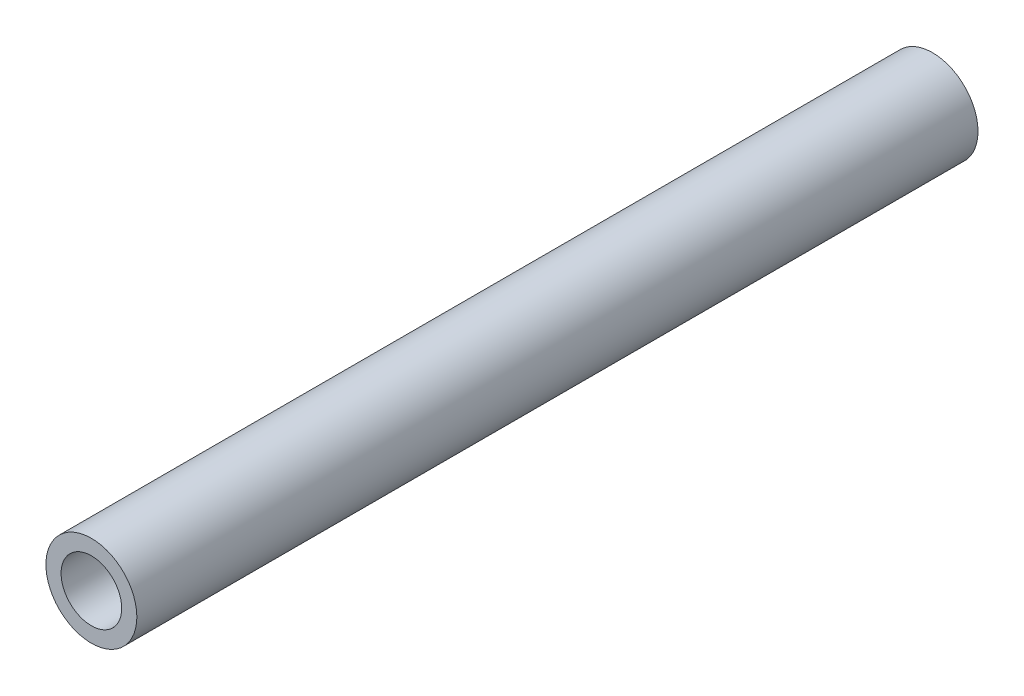
ISO-10303-21;
HEADER;
FILE_DESCRIPTION(('STEP AP214'),'2;1');
FILE_NAME('part.step','',(''),(''),'','','');
FILE_SCHEMA(('AUTOMOTIVE_DESIGN { 1 0 10303 214 1 1 1 1 }'));
ENDSEC;
DATA;
#1=APPLICATION_CONTEXT('core data for automotive mechanical design processes');
#2=APPLICATION_PROTOCOL_DEFINITION('international standard','automotive_design',2000,#1);
#3=PRODUCT_CONTEXT('',#1,'mechanical');
#4=PRODUCT('Part','Part','',(#3));
#5=PRODUCT_RELATED_PRODUCT_CATEGORY('part','',(#4));
#6=PRODUCT_DEFINITION_FORMATION('','',#4);
#7=PRODUCT_DEFINITION_CONTEXT('part definition',#1,'design');
#8=PRODUCT_DEFINITION('design','',#6,#7);
#9=PRODUCT_DEFINITION_SHAPE('','',#8);
#10=(LENGTH_UNIT() NAMED_UNIT(*) SI_UNIT(.MILLI.,.METRE.));
#11=(NAMED_UNIT(*) PLANE_ANGLE_UNIT() SI_UNIT($,.RADIAN.));
#12=(NAMED_UNIT(*) SI_UNIT($,.STERADIAN.) SOLID_ANGLE_UNIT());
#13=UNCERTAINTY_MEASURE_WITH_UNIT(LENGTH_MEASURE(1.E-05),#10,'distance_accuracy_value','');
#14=(GEOMETRIC_REPRESENTATION_CONTEXT(3) GLOBAL_UNCERTAINTY_ASSIGNED_CONTEXT((#13)) GLOBAL_UNIT_ASSIGNED_CONTEXT((#10,
#11,#12)) REPRESENTATION_CONTEXT('',''));
#15=CARTESIAN_POINT('',(0.,0.,0.));
#16=DIRECTION('',(0.,0.,1.));
#17=DIRECTION('',(1.,0.,0.));
#18=AXIS2_PLACEMENT_3D('',#15,#16,#17);
#19=CARTESIAN_POINT('',(0.,0.,55.5));
#20=DIRECTION('',(0.,0.,1.));
#21=DIRECTION('',(1.,0.,0.));
#22=AXIS2_PLACEMENT_3D('',#19,#20,#21);
#23=PLANE('',#22);
#24=CARTESIAN_POINT('',(0.,0.,55.5));
#25=DIRECTION('',(0.,0.,1.));
#26=DIRECTION('',(1.,0.,0.));
#27=AXIS2_PLACEMENT_3D('',#24,#25,#26);
#28=CIRCLE('',#27,3.);
#29=CARTESIAN_POINT('',(3.,0.,55.5));
#30=VERTEX_POINT('',#29);
#31=EDGE_CURVE('E11',#30,#30,#28,.T.);
#32=ORIENTED_EDGE('',*,*,#31,.T.);
#33=EDGE_LOOP('',(#32));
#34=FACE_BOUND('',#33,.T.);
#35=CARTESIAN_POINT('',(0.,0.,55.5));
#36=DIRECTION('',(0.,0.,1.));
#37=DIRECTION('',(1.,0.,0.));
#38=AXIS2_PLACEMENT_3D('',#35,#36,#37);
#39=CIRCLE('',#38,2.);
#40=CARTESIAN_POINT('',(2.,0.,55.5));
#41=VERTEX_POINT('',#40);
#42=EDGE_CURVE('E50',#41,#41,#39,.T.);
#43=ORIENTED_EDGE('',*,*,#42,.F.);
#44=EDGE_LOOP('',(#43));
#45=FACE_BOUND('',#44,.T.);
#46=ADVANCED_FACE('F39',(#34,#45),#23,.T.);
#47=CARTESIAN_POINT('',(0.,0.,0.));
#48=DIRECTION('',(0.,0.,1.));
#49=DIRECTION('',(1.,0.,0.));
#50=AXIS2_PLACEMENT_3D('',#47,#48,#49);
#51=PLANE('',#50);
#52=CARTESIAN_POINT('',(0.,0.,0.));
#53=DIRECTION('',(0.,0.,1.));
#54=DIRECTION('',(1.,0.,0.));
#55=AXIS2_PLACEMENT_3D('',#52,#53,#54);
#56=CIRCLE('',#55,3.);
#57=CARTESIAN_POINT('',(3.,0.,0.));
#58=VERTEX_POINT('',#57);
#59=EDGE_CURVE('E43',#58,#58,#56,.T.);
#60=ORIENTED_EDGE('',*,*,#59,.F.);
#61=EDGE_LOOP('',(#60));
#62=FACE_BOUND('',#61,.T.);
#63=CARTESIAN_POINT('',(0.,0.,0.));
#64=DIRECTION('',(0.,0.,1.));
#65=DIRECTION('',(1.,0.,0.));
#66=AXIS2_PLACEMENT_3D('',#63,#64,#65);
#67=CIRCLE('',#66,2.);
#68=CARTESIAN_POINT('',(2.,0.,0.));
#69=VERTEX_POINT('',#68);
#70=EDGE_CURVE('E52',#69,#69,#67,.T.);
#71=ORIENTED_EDGE('',*,*,#70,.T.);
#72=EDGE_LOOP('',(#71));
#73=FACE_BOUND('',#72,.T.);
#74=ADVANCED_FACE('F62',(#62,#73),#51,.F.);
#75=CARTESIAN_POINT('',(0.,0.,55.5));
#76=DIRECTION('',(0.,0.,-1.));
#77=DIRECTION('',(-1.,0.,0.));
#78=AXIS2_PLACEMENT_3D('',#75,#76,#77);
#79=CYLINDRICAL_SURFACE('',#78,3.);
#80=ORIENTED_EDGE('',*,*,#31,.F.);
#81=EDGE_LOOP('',(#80));
#82=FACE_BOUND('',#81,.T.);
#83=ORIENTED_EDGE('',*,*,#59,.T.);
#84=EDGE_LOOP('',(#83));
#85=FACE_BOUND('',#84,.T.);
#86=ADVANCED_FACE('F41',(#82,#85),#79,.T.);
#87=CARTESIAN_POINT('',(0.,0.,55.5));
#88=DIRECTION('',(0.,0.,-1.));
#89=DIRECTION('',(-1.,0.,0.));
#90=AXIS2_PLACEMENT_3D('',#87,#88,#89);
#91=CYLINDRICAL_SURFACE('',#90,2.);
#92=ORIENTED_EDGE('',*,*,#42,.T.);
#93=EDGE_LOOP('',(#92));
#94=FACE_BOUND('',#93,.T.);
#95=ORIENTED_EDGE('',*,*,#70,.F.);
#96=EDGE_LOOP('',(#95));
#97=FACE_BOUND('',#96,.T.);
#98=ADVANCED_FACE('F58',(#94,#97),#91,.F.);
#99=CLOSED_SHELL('',(#46,#74,#86,#98));
#100=MANIFOLD_SOLID_BREP('B2',#99);
#101=ADVANCED_BREP_SHAPE_REPRESENTATION('',(#18,#100),#14);
#102=SHAPE_DEFINITION_REPRESENTATION(#9,#101);
ENDSEC;
END-ISO-10303-21;
